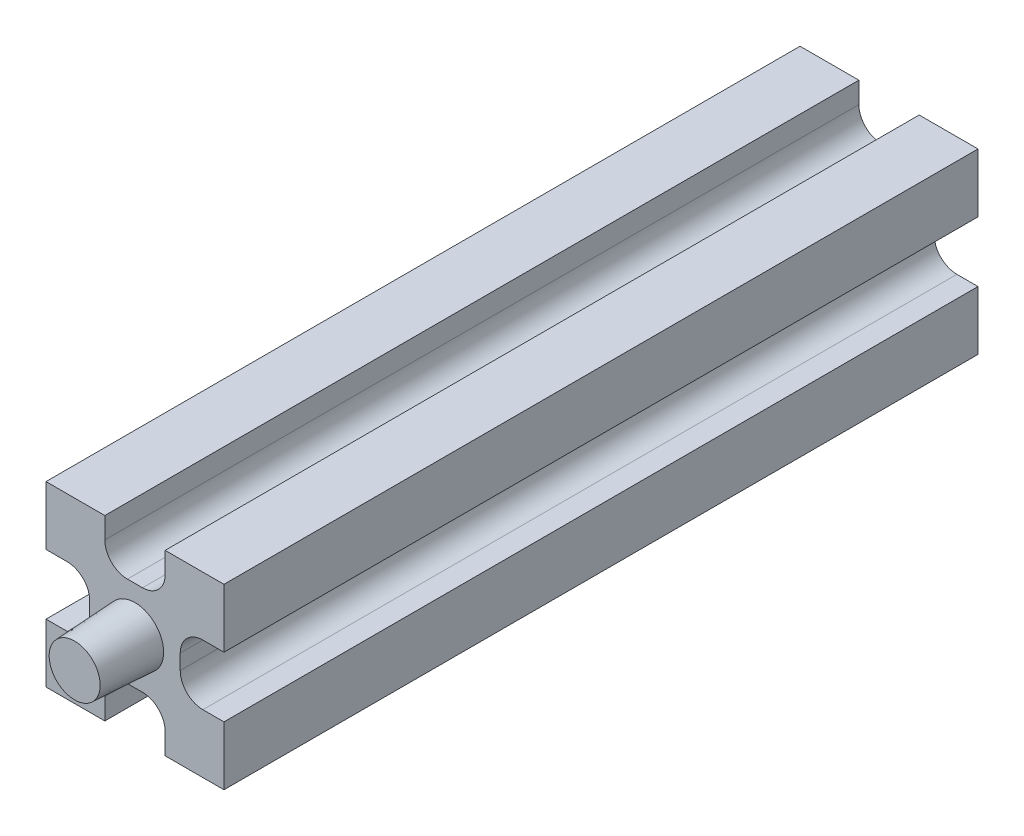
ISO-10303-21;
HEADER;
FILE_DESCRIPTION(('STEP AP214'),'2;1');
FILE_NAME('part.step','',(''),(''),'','','');
FILE_SCHEMA(('AUTOMOTIVE_DESIGN { 1 0 10303 214 1 1 1 1 }'));
ENDSEC;
DATA;
#1=APPLICATION_CONTEXT('core data for automotive mechanical design processes');
#2=APPLICATION_PROTOCOL_DEFINITION('international standard','automotive_design',2000,#1);
#3=PRODUCT_CONTEXT('',#1,'mechanical');
#4=PRODUCT('Part','Part','',(#3));
#5=PRODUCT_RELATED_PRODUCT_CATEGORY('part','',(#4));
#6=PRODUCT_DEFINITION_FORMATION('','',#4);
#7=PRODUCT_DEFINITION_CONTEXT('part definition',#1,'design');
#8=PRODUCT_DEFINITION('design','',#6,#7);
#9=PRODUCT_DEFINITION_SHAPE('','',#8);
#10=(LENGTH_UNIT() NAMED_UNIT(*) SI_UNIT(.MILLI.,.METRE.));
#11=(NAMED_UNIT(*) PLANE_ANGLE_UNIT() SI_UNIT($,.RADIAN.));
#12=(NAMED_UNIT(*) SI_UNIT($,.STERADIAN.) SOLID_ANGLE_UNIT());
#13=UNCERTAINTY_MEASURE_WITH_UNIT(LENGTH_MEASURE(1.E-05),#10,'distance_accuracy_value','');
#14=(GEOMETRIC_REPRESENTATION_CONTEXT(3) GLOBAL_UNCERTAINTY_ASSIGNED_CONTEXT((#13)) GLOBAL_UNIT_ASSIGNED_CONTEXT((#10,
#11,#12)) REPRESENTATION_CONTEXT('',''));
#15=CARTESIAN_POINT('',(0.,0.,0.));
#16=DIRECTION('',(0.,0.,1.));
#17=DIRECTION('',(1.,0.,0.));
#18=AXIS2_PLACEMENT_3D('',#15,#16,#17);
#19=CARTESIAN_POINT('',(121743.416897498,0.,-50000.));
#20=DIRECTION('',(-1.,0.,0.));
#21=DIRECTION('',(0.,0.,1.));
#22=AXIS2_PLACEMENT_3D('',#19,#20,#21);
#23=PLANE('',#22);
#24=DIRECTION('',(0.,-1.,0.));
#25=VECTOR('',#24,1.);
#26=CARTESIAN_POINT('',(121743.416897498,0.,0.));
#27=LINE('',#26,#25);
#28=CARTESIAN_POINT('',(121743.416897498,168837.836627923,0.));
#29=VERTEX_POINT('',#28);
#30=CARTESIAN_POINT('',(121743.416897498,167837.836627923,0.));
#31=VERTEX_POINT('',#30);
#32=EDGE_CURVE('E249',#29,#31,#27,.T.);
#33=ORIENTED_EDGE('',*,*,#32,.F.);
#34=DIRECTION('',(0.,0.,1.));
#35=VECTOR('',#34,1.);
#36=CARTESIAN_POINT('',(121743.416897498,168837.836627923,-50000.));
#37=LINE('',#36,#35);
#38=CARTESIAN_POINT('',(121743.416897498,168837.836627923,-50000.));
#39=VERTEX_POINT('',#38);
#40=EDGE_CURVE('E11',#39,#29,#37,.T.);
#41=ORIENTED_EDGE('',*,*,#40,.F.);
#42=DIRECTION('',(0.,-1.,0.));
#43=VECTOR('',#42,1.);
#44=CARTESIAN_POINT('',(121743.416897498,0.,-50000.));
#45=LINE('',#44,#43);
#46=CARTESIAN_POINT('',(121743.416897498,167837.836627923,-50000.));
#47=VERTEX_POINT('',#46);
#48=EDGE_CURVE('E317',#39,#47,#45,.T.);
#49=ORIENTED_EDGE('',*,*,#48,.T.);
#50=DIRECTION('',(0.,0.,1.));
#51=VECTOR('',#50,1.);
#52=CARTESIAN_POINT('',(121743.416897498,167837.836627923,-50000.));
#53=LINE('',#52,#51);
#54=EDGE_CURVE('E38',#47,#31,#53,.T.);
#55=ORIENTED_EDGE('',*,*,#54,.T.);
#56=EDGE_LOOP('',(#33,#41,#49,#55));
#57=FACE_BOUND('',#56,.T.);
#58=ADVANCED_FACE('F35',(#57),#23,.T.);
#59=CARTESIAN_POINT('',(120243.416897498,168837.836627923,-50000.));
#60=DIRECTION('',(0.,0.,1.));
#61=DIRECTION('',(1.,0.,0.));
#62=AXIS2_PLACEMENT_3D('',#59,#60,#61);
#63=CYLINDRICAL_SURFACE('',#62,1500.00000000001);
#64=CARTESIAN_POINT('',(120243.416897498,168837.836627923,0.));
#65=DIRECTION('',(0.,0.,1.));
#66=DIRECTION('',(1.,0.,0.));
#67=AXIS2_PLACEMENT_3D('',#64,#65,#66);
#68=CIRCLE('',#67,1500.00000000001);
#69=CARTESIAN_POINT('',(120243.416897498,170337.836627923,0.));
#70=VERTEX_POINT('',#69);
#71=EDGE_CURVE('E315',#70,#29,#68,.F.);
#72=ORIENTED_EDGE('',*,*,#71,.F.);
#73=DIRECTION('',(0.,0.,1.));
#74=VECTOR('',#73,1.);
#75=CARTESIAN_POINT('',(120243.416897498,170337.836627923,-50000.));
#76=LINE('',#75,#74);
#77=CARTESIAN_POINT('',(120243.416897498,170337.836627923,-50000.));
#78=VERTEX_POINT('',#77);
#79=EDGE_CURVE('E44',#78,#70,#76,.T.);
#80=ORIENTED_EDGE('',*,*,#79,.F.);
#81=CARTESIAN_POINT('',(120243.416897498,168837.836627923,-50000.));
#82=DIRECTION('',(0.,0.,1.));
#83=DIRECTION('',(1.,0.,0.));
#84=AXIS2_PLACEMENT_3D('',#81,#82,#83);
#85=CIRCLE('',#84,1500.00000000001);
#86=EDGE_CURVE('E244',#78,#39,#85,.F.);
#87=ORIENTED_EDGE('',*,*,#86,.T.);
#88=ORIENTED_EDGE('',*,*,#40,.T.);
#89=EDGE_LOOP('',(#72,#80,#87,#88));
#90=FACE_BOUND('',#89,.T.);
#91=ADVANCED_FACE('F382',(#90),#63,.F.);
#92=CARTESIAN_POINT('',(0.,170337.836627923,-50000.));
#93=DIRECTION('',(0.,-1.,0.));
#94=DIRECTION('',(0.,0.,-1.));
#95=AXIS2_PLACEMENT_3D('',#92,#93,#94);
#96=PLANE('',#95);
#97=DIRECTION('',(1.,0.,0.));
#98=VECTOR('',#97,1.);
#99=CARTESIAN_POINT('',(0.,170337.836627923,0.));
#100=LINE('',#99,#98);
#101=CARTESIAN_POINT('',(118843.416897498,170337.836627923,0.));
#102=VERTEX_POINT('',#101);
#103=EDGE_CURVE('E230',#102,#70,#100,.T.);
#104=ORIENTED_EDGE('',*,*,#103,.F.);
#105=DIRECTION('',(0.,0.,1.));
#106=VECTOR('',#105,1.);
#107=CARTESIAN_POINT('',(118843.416897498,170337.836627923,-50000.));
#108=LINE('',#107,#106);
#109=CARTESIAN_POINT('',(118843.416897498,170337.836627923,-50000.));
#110=VERTEX_POINT('',#109);
#111=EDGE_CURVE('E224',#110,#102,#108,.T.);
#112=ORIENTED_EDGE('',*,*,#111,.F.);
#113=DIRECTION('',(1.,0.,0.));
#114=VECTOR('',#113,1.);
#115=CARTESIAN_POINT('',(0.,170337.836627923,-50000.));
#116=LINE('',#115,#114);
#117=EDGE_CURVE('E228',#110,#78,#116,.T.);
#118=ORIENTED_EDGE('',*,*,#117,.T.);
#119=ORIENTED_EDGE('',*,*,#79,.T.);
#120=EDGE_LOOP('',(#104,#112,#118,#119));
#121=FACE_BOUND('',#120,.T.);
#122=ADVANCED_FACE('F226',(#121),#96,.T.);
#123=CARTESIAN_POINT('',(118843.416897498,0.,-50000.));
#124=DIRECTION('',(1.,0.,0.));
#125=DIRECTION('',(0.,0.,-1.));
#126=AXIS2_PLACEMENT_3D('',#123,#124,#125);
#127=PLANE('',#126);
#128=DIRECTION('',(0.,1.,0.));
#129=VECTOR('',#128,1.);
#130=CARTESIAN_POINT('',(118843.416897498,0.,0.));
#131=LINE('',#130,#129);
#132=CARTESIAN_POINT('',(118843.416897498,174237.836627923,0.));
#133=VERTEX_POINT('',#132);
#134=EDGE_CURVE('E312',#102,#133,#131,.T.);
#135=ORIENTED_EDGE('',*,*,#134,.T.);
#136=DIRECTION('',(0.,0.,1.));
#137=VECTOR('',#136,1.);
#138=CARTESIAN_POINT('',(118843.416897498,174237.836627923,-50000.));
#139=LINE('',#138,#137);
#140=CARTESIAN_POINT('',(118843.416897498,174237.836627923,-50000.));
#141=VERTEX_POINT('',#140);
#142=EDGE_CURVE('E233',#141,#133,#139,.T.);
#143=ORIENTED_EDGE('',*,*,#142,.F.);
#144=DIRECTION('',(0.,1.,0.));
#145=VECTOR('',#144,1.);
#146=CARTESIAN_POINT('',(118843.416897498,0.,-50000.));
#147=LINE('',#146,#145);
#148=EDGE_CURVE('E236',#110,#141,#147,.T.);
#149=ORIENTED_EDGE('',*,*,#148,.F.);
#150=ORIENTED_EDGE('',*,*,#111,.T.);
#151=EDGE_LOOP('',(#135,#143,#149,#150));
#152=FACE_BOUND('',#151,.T.);
#153=ADVANCED_FACE('F237',(#152),#127,.F.);
#154=CARTESIAN_POINT('',(0.,174237.836627923,-50000.));
#155=DIRECTION('',(0.,-1.,0.));
#156=DIRECTION('',(0.,0.,-1.));
#157=AXIS2_PLACEMENT_3D('',#154,#155,#156);
#158=PLANE('',#157);
#159=DIRECTION('',(1.,0.,0.));
#160=VECTOR('',#159,1.);
#161=CARTESIAN_POINT('',(0.,174237.836627923,0.));
#162=LINE('',#161,#160);
#163=CARTESIAN_POINT('',(122743.416897498,174237.836627923,0.));
#164=VERTEX_POINT('',#163);
#165=EDGE_CURVE('E310',#133,#164,#162,.T.);
#166=ORIENTED_EDGE('',*,*,#165,.T.);
#167=DIRECTION('',(0.,0.,1.));
#168=VECTOR('',#167,1.);
#169=CARTESIAN_POINT('',(122743.416897498,174237.836627923,-50000.));
#170=LINE('',#169,#168);
#171=CARTESIAN_POINT('',(122743.416897498,174237.836627923,-50000.));
#172=VERTEX_POINT('',#171);
#173=EDGE_CURVE('E321',#172,#164,#170,.T.);
#174=ORIENTED_EDGE('',*,*,#173,.F.);
#175=DIRECTION('',(1.,0.,0.));
#176=VECTOR('',#175,1.);
#177=CARTESIAN_POINT('',(0.,174237.836627923,-50000.));
#178=LINE('',#177,#176);
#179=EDGE_CURVE('E241',#141,#172,#178,.T.);
#180=ORIENTED_EDGE('',*,*,#179,.F.);
#181=ORIENTED_EDGE('',*,*,#142,.T.);
#182=EDGE_LOOP('',(#166,#174,#180,#181));
#183=FACE_BOUND('',#182,.T.);
#184=ADVANCED_FACE('F395',(#183),#158,.F.);
#185=CARTESIAN_POINT('',(122743.416897498,0.,-50000.));
#186=DIRECTION('',(-1.,0.,0.));
#187=DIRECTION('',(0.,0.,1.));
#188=AXIS2_PLACEMENT_3D('',#185,#186,#187);
#189=PLANE('',#188);
#190=DIRECTION('',(0.,-1.,0.));
#191=VECTOR('',#190,1.);
#192=CARTESIAN_POINT('',(122743.416897498,0.,0.));
#193=LINE('',#192,#191);
#194=CARTESIAN_POINT('',(122743.416897498,172837.836627923,0.));
#195=VERTEX_POINT('',#194);
#196=EDGE_CURVE('E308',#164,#195,#193,.T.);
#197=ORIENTED_EDGE('',*,*,#196,.T.);
#198=DIRECTION('',(0.,0.,1.));
#199=VECTOR('',#198,1.);
#200=CARTESIAN_POINT('',(122743.416897498,172837.836627923,-50000.));
#201=LINE('',#200,#199);
#202=CARTESIAN_POINT('',(122743.416897498,172837.836627923,-50000.));
#203=VERTEX_POINT('',#202);
#204=EDGE_CURVE('E324',#203,#195,#201,.T.);
#205=ORIENTED_EDGE('',*,*,#204,.F.);
#206=DIRECTION('',(0.,-1.,0.));
#207=VECTOR('',#206,1.);
#208=CARTESIAN_POINT('',(122743.416897498,0.,-50000.));
#209=LINE('',#208,#207);
#210=EDGE_CURVE('E564',#172,#203,#209,.T.);
#211=ORIENTED_EDGE('',*,*,#210,.F.);
#212=ORIENTED_EDGE('',*,*,#173,.T.);
#213=EDGE_LOOP('',(#197,#205,#211,#212));
#214=FACE_BOUND('',#213,.T.);
#215=ADVANCED_FACE('F398',(#214),#189,.F.);
#216=CARTESIAN_POINT('',(124243.416897498,172837.836627923,-50000.));
#217=DIRECTION('',(0.,0.,1.));
#218=DIRECTION('',(1.,0.,0.));
#219=AXIS2_PLACEMENT_3D('',#216,#217,#218);
#220=CYLINDRICAL_SURFACE('',#219,1500.);
#221=CARTESIAN_POINT('',(124243.416897498,172837.836627923,0.));
#222=DIRECTION('',(0.,0.,1.));
#223=DIRECTION('',(1.,0.,0.));
#224=AXIS2_PLACEMENT_3D('',#221,#222,#223);
#225=CIRCLE('',#224,1500.);
#226=CARTESIAN_POINT('',(124243.416897498,171337.836627923,0.));
#227=VERTEX_POINT('',#226);
#228=EDGE_CURVE('E306',#195,#227,#225,.T.);
#229=ORIENTED_EDGE('',*,*,#228,.T.);
#230=DIRECTION('',(0.,0.,1.));
#231=VECTOR('',#230,1.);
#232=CARTESIAN_POINT('',(124243.416897498,171337.836627923,-50000.));
#233=LINE('',#232,#231);
#234=CARTESIAN_POINT('',(124243.416897498,171337.836627923,-50000.));
#235=VERTEX_POINT('',#234);
#236=EDGE_CURVE('E327',#235,#227,#233,.T.);
#237=ORIENTED_EDGE('',*,*,#236,.F.);
#238=CARTESIAN_POINT('',(124243.416897498,172837.836627923,-50000.));
#239=DIRECTION('',(0.,0.,1.));
#240=DIRECTION('',(1.,0.,0.));
#241=AXIS2_PLACEMENT_3D('',#238,#239,#240);
#242=CIRCLE('',#241,1500.);
#243=EDGE_CURVE('E562',#203,#235,#242,.T.);
#244=ORIENTED_EDGE('',*,*,#243,.F.);
#245=ORIENTED_EDGE('',*,*,#204,.T.);
#246=EDGE_LOOP('',(#229,#237,#244,#245));
#247=FACE_BOUND('',#246,.T.);
#248=ADVANCED_FACE('F402',(#247),#220,.F.);
#249=CARTESIAN_POINT('',(0.,171337.836627923,-50000.));
#250=DIRECTION('',(0.,-1.,0.));
#251=DIRECTION('',(0.,0.,-1.));
#252=AXIS2_PLACEMENT_3D('',#249,#250,#251);
#253=PLANE('',#252);
#254=DIRECTION('',(1.,0.,0.));
#255=VECTOR('',#254,1.);
#256=CARTESIAN_POINT('',(0.,171337.836627923,0.));
#257=LINE('',#256,#255);
#258=CARTESIAN_POINT('',(125243.416897498,171337.836627923,0.));
#259=VERTEX_POINT('',#258);
#260=EDGE_CURVE('E304',#227,#259,#257,.T.);
#261=ORIENTED_EDGE('',*,*,#260,.T.);
#262=DIRECTION('',(0.,0.,1.));
#263=VECTOR('',#262,1.);
#264=CARTESIAN_POINT('',(125243.416897498,171337.836627923,-50000.));
#265=LINE('',#264,#263);
#266=CARTESIAN_POINT('',(125243.416897498,171337.836627923,-50000.));
#267=VERTEX_POINT('',#266);
#268=EDGE_CURVE('E330',#267,#259,#265,.T.);
#269=ORIENTED_EDGE('',*,*,#268,.F.);
#270=DIRECTION('',(1.,0.,0.));
#271=VECTOR('',#270,1.);
#272=CARTESIAN_POINT('',(0.,171337.836627923,-50000.));
#273=LINE('',#272,#271);
#274=EDGE_CURVE('E560',#235,#267,#273,.T.);
#275=ORIENTED_EDGE('',*,*,#274,.F.);
#276=ORIENTED_EDGE('',*,*,#236,.T.);
#277=EDGE_LOOP('',(#261,#269,#275,#276));
#278=FACE_BOUND('',#277,.T.);
#279=ADVANCED_FACE('F406',(#278),#253,.F.);
#280=CARTESIAN_POINT('',(125243.416897498,172837.836627923,-50000.));
#281=DIRECTION('',(0.,0.,1.));
#282=DIRECTION('',(1.,0.,0.));
#283=AXIS2_PLACEMENT_3D('',#280,#281,#282);
#284=CYLINDRICAL_SURFACE('',#283,1500.);
#285=CARTESIAN_POINT('',(125243.416897498,172837.836627923,0.));
#286=DIRECTION('',(0.,0.,1.));
#287=DIRECTION('',(1.,0.,0.));
#288=AXIS2_PLACEMENT_3D('',#285,#286,#287);
#289=CIRCLE('',#288,1500.);
#290=CARTESIAN_POINT('',(126743.416897498,172837.836627923,0.));
#291=VERTEX_POINT('',#290);
#292=EDGE_CURVE('E302',#259,#291,#289,.T.);
#293=ORIENTED_EDGE('',*,*,#292,.T.);
#294=DIRECTION('',(0.,0.,1.));
#295=VECTOR('',#294,1.);
#296=CARTESIAN_POINT('',(126743.416897498,172837.836627923,-50000.));
#297=LINE('',#296,#295);
#298=CARTESIAN_POINT('',(126743.416897498,172837.836627923,-50000.));
#299=VERTEX_POINT('',#298);
#300=EDGE_CURVE('E333',#299,#291,#297,.T.);
#301=ORIENTED_EDGE('',*,*,#300,.F.);
#302=CARTESIAN_POINT('',(125243.416897498,172837.836627923,-50000.));
#303=DIRECTION('',(0.,0.,1.));
#304=DIRECTION('',(1.,0.,0.));
#305=AXIS2_PLACEMENT_3D('',#302,#303,#304);
#306=CIRCLE('',#305,1500.);
#307=EDGE_CURVE('E558',#267,#299,#306,.T.);
#308=ORIENTED_EDGE('',*,*,#307,.F.);
#309=ORIENTED_EDGE('',*,*,#268,.T.);
#310=EDGE_LOOP('',(#293,#301,#308,#309));
#311=FACE_BOUND('',#310,.T.);
#312=ADVANCED_FACE('F410',(#311),#284,.F.);
#313=CARTESIAN_POINT('',(126743.416897496,-1.2865230597419E-09,-50000.));
#314=DIRECTION('',(1.,0.,0.));
#315=DIRECTION('',(0.,1.,0.));
#316=AXIS2_PLACEMENT_3D('',#313,#314,#315);
#317=PLANE('',#316);
#318=DIRECTION('',(0.,1.,0.));
#319=VECTOR('',#318,1.);
#320=CARTESIAN_POINT('',(126743.416897496,-1.2865230597419E-09,0.));
#321=LINE('',#320,#319);
#322=CARTESIAN_POINT('',(126743.416897498,174237.836627923,0.));
#323=VERTEX_POINT('',#322);
#324=EDGE_CURVE('E300',#291,#323,#321,.T.);
#325=ORIENTED_EDGE('',*,*,#324,.T.);
#326=DIRECTION('',(0.,0.,1.));
#327=VECTOR('',#326,1.);
#328=CARTESIAN_POINT('',(126743.416897498,174237.836627923,-50000.));
#329=LINE('',#328,#327);
#330=CARTESIAN_POINT('',(126743.416897498,174237.836627923,-50000.));
#331=VERTEX_POINT('',#330);
#332=EDGE_CURVE('E336',#331,#323,#329,.T.);
#333=ORIENTED_EDGE('',*,*,#332,.F.);
#334=DIRECTION('',(0.,1.,0.));
#335=VECTOR('',#334,1.);
#336=CARTESIAN_POINT('',(126743.416897496,-1.2865230597419E-09,-50000.));
#337=LINE('',#336,#335);
#338=EDGE_CURVE('E556',#299,#331,#337,.T.);
#339=ORIENTED_EDGE('',*,*,#338,.F.);
#340=ORIENTED_EDGE('',*,*,#300,.T.);
#341=EDGE_LOOP('',(#325,#333,#339,#340));
#342=FACE_BOUND('',#341,.T.);
#343=ADVANCED_FACE('F414',(#342),#317,.F.);
#344=CARTESIAN_POINT('',(0.,174237.836627923,-50000.));
#345=DIRECTION('',(0.,-1.,0.));
#346=DIRECTION('',(0.,0.,-1.));
#347=AXIS2_PLACEMENT_3D('',#344,#345,#346);
#348=PLANE('',#347);
#349=DIRECTION('',(1.,0.,0.));
#350=VECTOR('',#349,1.);
#351=CARTESIAN_POINT('',(0.,174237.836627923,0.));
#352=LINE('',#351,#350);
#353=CARTESIAN_POINT('',(130643.416897498,174237.836627923,0.));
#354=VERTEX_POINT('',#353);
#355=EDGE_CURVE('E298',#323,#354,#352,.T.);
#356=ORIENTED_EDGE('',*,*,#355,.T.);
#357=DIRECTION('',(0.,0.,1.));
#358=VECTOR('',#357,1.);
#359=CARTESIAN_POINT('',(130643.416897498,174237.836627923,-50000.));
#360=LINE('',#359,#358);
#361=CARTESIAN_POINT('',(130643.416897498,174237.836627923,-50000.));
#362=VERTEX_POINT('',#361);
#363=EDGE_CURVE('E339',#362,#354,#360,.T.);
#364=ORIENTED_EDGE('',*,*,#363,.F.);
#365=DIRECTION('',(1.,0.,0.));
#366=VECTOR('',#365,1.);
#367=CARTESIAN_POINT('',(0.,174237.836627923,-50000.));
#368=LINE('',#367,#366);
#369=EDGE_CURVE('E554',#331,#362,#368,.T.);
#370=ORIENTED_EDGE('',*,*,#369,.F.);
#371=ORIENTED_EDGE('',*,*,#332,.T.);
#372=EDGE_LOOP('',(#356,#364,#370,#371));
#373=FACE_BOUND('',#372,.T.);
#374=ADVANCED_FACE('F418',(#373),#348,.F.);
#375=CARTESIAN_POINT('',(130643.416897498,0.,-50000.));
#376=DIRECTION('',(-1.,0.,0.));
#377=DIRECTION('',(0.,0.,1.));
#378=AXIS2_PLACEMENT_3D('',#375,#376,#377);
#379=PLANE('',#378);
#380=DIRECTION('',(0.,-1.,0.));
#381=VECTOR('',#380,1.);
#382=CARTESIAN_POINT('',(130643.416897498,0.,0.));
#383=LINE('',#382,#381);
#384=CARTESIAN_POINT('',(130643.416897498,170337.836627923,0.));
#385=VERTEX_POINT('',#384);
#386=EDGE_CURVE('E296',#354,#385,#383,.T.);
#387=ORIENTED_EDGE('',*,*,#386,.T.);
#388=DIRECTION('',(0.,0.,1.));
#389=VECTOR('',#388,1.);
#390=CARTESIAN_POINT('',(130643.416897498,170337.836627923,-50000.));
#391=LINE('',#390,#389);
#392=CARTESIAN_POINT('',(130643.416897498,170337.836627923,-50000.));
#393=VERTEX_POINT('',#392);
#394=EDGE_CURVE('E342',#393,#385,#391,.T.);
#395=ORIENTED_EDGE('',*,*,#394,.F.);
#396=DIRECTION('',(0.,-1.,0.));
#397=VECTOR('',#396,1.);
#398=CARTESIAN_POINT('',(130643.416897498,0.,-50000.));
#399=LINE('',#398,#397);
#400=EDGE_CURVE('E552',#362,#393,#399,.T.);
#401=ORIENTED_EDGE('',*,*,#400,.F.);
#402=ORIENTED_EDGE('',*,*,#363,.T.);
#403=EDGE_LOOP('',(#387,#395,#401,#402));
#404=FACE_BOUND('',#403,.T.);
#405=ADVANCED_FACE('F422',(#404),#379,.F.);
#406=CARTESIAN_POINT('',(0.,170337.836627923,-50000.));
#407=DIRECTION('',(0.,1.,0.));
#408=DIRECTION('',(0.,0.,1.));
#409=AXIS2_PLACEMENT_3D('',#406,#407,#408);
#410=PLANE('',#409);
#411=DIRECTION('',(-1.,0.,0.));
#412=VECTOR('',#411,1.);
#413=CARTESIAN_POINT('',(0.,170337.836627923,0.));
#414=LINE('',#413,#412);
#415=CARTESIAN_POINT('',(129243.416897498,170337.836627923,0.));
#416=VERTEX_POINT('',#415);
#417=EDGE_CURVE('E294',#385,#416,#414,.T.);
#418=ORIENTED_EDGE('',*,*,#417,.T.);
#419=DIRECTION('',(0.,0.,1.));
#420=VECTOR('',#419,1.);
#421=CARTESIAN_POINT('',(129243.416897498,170337.836627923,-50000.));
#422=LINE('',#421,#420);
#423=CARTESIAN_POINT('',(129243.416897498,170337.836627923,-50000.));
#424=VERTEX_POINT('',#423);
#425=EDGE_CURVE('E345',#424,#416,#422,.T.);
#426=ORIENTED_EDGE('',*,*,#425,.F.);
#427=DIRECTION('',(-1.,0.,0.));
#428=VECTOR('',#427,1.);
#429=CARTESIAN_POINT('',(0.,170337.836627923,-50000.));
#430=LINE('',#429,#428);
#431=EDGE_CURVE('E550',#393,#424,#430,.T.);
#432=ORIENTED_EDGE('',*,*,#431,.F.);
#433=ORIENTED_EDGE('',*,*,#394,.T.);
#434=EDGE_LOOP('',(#418,#426,#432,#433));
#435=FACE_BOUND('',#434,.T.);
#436=ADVANCED_FACE('F426',(#435),#410,.F.);
#437=CARTESIAN_POINT('',(129243.416897498,168837.836627923,-50000.));
#438=DIRECTION('',(0.,0.,1.));
#439=DIRECTION('',(1.,0.,0.));
#440=AXIS2_PLACEMENT_3D('',#437,#438,#439);
#441=CYLINDRICAL_SURFACE('',#440,1500.00000000001);
#442=CARTESIAN_POINT('',(129243.416897498,168837.836627923,0.));
#443=DIRECTION('',(0.,0.,1.));
#444=DIRECTION('',(1.,0.,0.));
#445=AXIS2_PLACEMENT_3D('',#442,#443,#444);
#446=CIRCLE('',#445,1500.00000000001);
#447=CARTESIAN_POINT('',(127743.416897498,168837.836627923,0.));
#448=VERTEX_POINT('',#447);
#449=EDGE_CURVE('E292',#416,#448,#446,.T.);
#450=ORIENTED_EDGE('',*,*,#449,.T.);
#451=DIRECTION('',(0.,0.,1.));
#452=VECTOR('',#451,1.);
#453=CARTESIAN_POINT('',(127743.416897498,168837.836627923,-50000.));
#454=LINE('',#453,#452);
#455=CARTESIAN_POINT('',(127743.416897498,168837.836627923,-50000.));
#456=VERTEX_POINT('',#455);
#457=EDGE_CURVE('E348',#456,#448,#454,.T.);
#458=ORIENTED_EDGE('',*,*,#457,.F.);
#459=CARTESIAN_POINT('',(129243.416897498,168837.836627923,-50000.));
#460=DIRECTION('',(0.,0.,1.));
#461=DIRECTION('',(1.,0.,0.));
#462=AXIS2_PLACEMENT_3D('',#459,#460,#461);
#463=CIRCLE('',#462,1500.00000000001);
#464=EDGE_CURVE('E548',#424,#456,#463,.T.);
#465=ORIENTED_EDGE('',*,*,#464,.F.);
#466=ORIENTED_EDGE('',*,*,#425,.T.);
#467=EDGE_LOOP('',(#450,#458,#465,#466));
#468=FACE_BOUND('',#467,.T.);
#469=ADVANCED_FACE('F430',(#468),#441,.F.);
#470=CARTESIAN_POINT('',(127743.416897498,0.,-50000.));
#471=DIRECTION('',(-1.,0.,0.));
#472=DIRECTION('',(0.,0.,1.));
#473=AXIS2_PLACEMENT_3D('',#470,#471,#472);
#474=PLANE('',#473);
#475=DIRECTION('',(0.,-1.,0.));
#476=VECTOR('',#475,1.);
#477=CARTESIAN_POINT('',(127743.416897498,0.,0.));
#478=LINE('',#477,#476);
#479=CARTESIAN_POINT('',(127743.416897498,167837.836627923,0.));
#480=VERTEX_POINT('',#479);
#481=EDGE_CURVE('E290',#448,#480,#478,.T.);
#482=ORIENTED_EDGE('',*,*,#481,.T.);
#483=DIRECTION('',(0.,0.,1.));
#484=VECTOR('',#483,1.);
#485=CARTESIAN_POINT('',(127743.416897498,167837.836627923,-50000.));
#486=LINE('',#485,#484);
#487=CARTESIAN_POINT('',(127743.416897498,167837.836627923,-50000.));
#488=VERTEX_POINT('',#487);
#489=EDGE_CURVE('E351',#488,#480,#486,.T.);
#490=ORIENTED_EDGE('',*,*,#489,.F.);
#491=DIRECTION('',(0.,-1.,0.));
#492=VECTOR('',#491,1.);
#493=CARTESIAN_POINT('',(127743.416897498,0.,-50000.));
#494=LINE('',#493,#492);
#495=EDGE_CURVE('E546',#456,#488,#494,.T.);
#496=ORIENTED_EDGE('',*,*,#495,.F.);
#497=ORIENTED_EDGE('',*,*,#457,.T.);
#498=EDGE_LOOP('',(#482,#490,#496,#497));
#499=FACE_BOUND('',#498,.T.);
#500=ADVANCED_FACE('F434',(#499),#474,.F.);
#501=CARTESIAN_POINT('',(129243.416897498,167837.836627923,-50000.));
#502=DIRECTION('',(0.,0.,1.));
#503=DIRECTION('',(1.,0.,0.));
#504=AXIS2_PLACEMENT_3D('',#501,#502,#503);
#505=CYLINDRICAL_SURFACE('',#504,1500.00000000001);
#506=CARTESIAN_POINT('',(129243.416897498,167837.836627923,0.));
#507=DIRECTION('',(0.,0.,1.));
#508=DIRECTION('',(1.,0.,0.));
#509=AXIS2_PLACEMENT_3D('',#506,#507,#508);
#510=CIRCLE('',#509,1500.00000000001);
#511=CARTESIAN_POINT('',(129243.416897498,166337.836627923,0.));
#512=VERTEX_POINT('',#511);
#513=EDGE_CURVE('E288',#480,#512,#510,.T.);
#514=ORIENTED_EDGE('',*,*,#513,.T.);
#515=DIRECTION('',(0.,0.,1.));
#516=VECTOR('',#515,1.);
#517=CARTESIAN_POINT('',(129243.416897498,166337.836627923,-50000.));
#518=LINE('',#517,#516);
#519=CARTESIAN_POINT('',(129243.416897498,166337.836627923,-50000.));
#520=VERTEX_POINT('',#519);
#521=EDGE_CURVE('E354',#520,#512,#518,.T.);
#522=ORIENTED_EDGE('',*,*,#521,.F.);
#523=CARTESIAN_POINT('',(129243.416897498,167837.836627923,-50000.));
#524=DIRECTION('',(0.,0.,1.));
#525=DIRECTION('',(1.,0.,0.));
#526=AXIS2_PLACEMENT_3D('',#523,#524,#525);
#527=CIRCLE('',#526,1500.00000000001);
#528=EDGE_CURVE('E544',#488,#520,#527,.T.);
#529=ORIENTED_EDGE('',*,*,#528,.F.);
#530=ORIENTED_EDGE('',*,*,#489,.T.);
#531=EDGE_LOOP('',(#514,#522,#529,#530));
#532=FACE_BOUND('',#531,.T.);
#533=ADVANCED_FACE('F438',(#532),#505,.F.);
#534=CARTESIAN_POINT('',(0.,166337.836627923,-50000.));
#535=DIRECTION('',(0.,-1.,0.));
#536=DIRECTION('',(0.,0.,-1.));
#537=AXIS2_PLACEMENT_3D('',#534,#535,#536);
#538=PLANE('',#537);
#539=DIRECTION('',(1.,0.,0.));
#540=VECTOR('',#539,1.);
#541=CARTESIAN_POINT('',(0.,166337.836627923,0.));
#542=LINE('',#541,#540);
#543=CARTESIAN_POINT('',(130643.416897498,166337.836627923,0.));
#544=VERTEX_POINT('',#543);
#545=EDGE_CURVE('E286',#512,#544,#542,.T.);
#546=ORIENTED_EDGE('',*,*,#545,.T.);
#547=DIRECTION('',(0.,0.,1.));
#548=VECTOR('',#547,1.);
#549=CARTESIAN_POINT('',(130643.416897498,166337.836627923,-50000.));
#550=LINE('',#549,#548);
#551=CARTESIAN_POINT('',(130643.416897498,166337.836627923,-50000.));
#552=VERTEX_POINT('',#551);
#553=EDGE_CURVE('E357',#552,#544,#550,.T.);
#554=ORIENTED_EDGE('',*,*,#553,.F.);
#555=DIRECTION('',(1.,0.,0.));
#556=VECTOR('',#555,1.);
#557=CARTESIAN_POINT('',(0.,166337.836627923,-50000.));
#558=LINE('',#557,#556);
#559=EDGE_CURVE('E542',#520,#552,#558,.T.);
#560=ORIENTED_EDGE('',*,*,#559,.F.);
#561=ORIENTED_EDGE('',*,*,#521,.T.);
#562=EDGE_LOOP('',(#546,#554,#560,#561));
#563=FACE_BOUND('',#562,.T.);
#564=ADVANCED_FACE('F442',(#563),#538,.F.);
#565=CARTESIAN_POINT('',(130643.416897498,0.,-50000.));
#566=DIRECTION('',(-1.,0.,0.));
#567=DIRECTION('',(0.,0.,1.));
#568=AXIS2_PLACEMENT_3D('',#565,#566,#567);
#569=PLANE('',#568);
#570=DIRECTION('',(0.,-1.,0.));
#571=VECTOR('',#570,1.);
#572=CARTESIAN_POINT('',(130643.416897498,0.,0.));
#573=LINE('',#572,#571);
#574=CARTESIAN_POINT('',(130643.416897498,162437.836627923,0.));
#575=VERTEX_POINT('',#574);
#576=EDGE_CURVE('E283',#544,#575,#573,.T.);
#577=ORIENTED_EDGE('',*,*,#576,.T.);
#578=DIRECTION('',(0.,0.,1.));
#579=VECTOR('',#578,1.);
#580=CARTESIAN_POINT('',(130643.416897498,162437.836627923,-50000.));
#581=LINE('',#580,#579);
#582=CARTESIAN_POINT('',(130643.416897498,162437.836627923,-50000.));
#583=VERTEX_POINT('',#582);
#584=EDGE_CURVE('E360',#583,#575,#581,.T.);
#585=ORIENTED_EDGE('',*,*,#584,.F.);
#586=DIRECTION('',(0.,-1.,0.));
#587=VECTOR('',#586,1.);
#588=CARTESIAN_POINT('',(130643.416897498,0.,-50000.));
#589=LINE('',#588,#587);
#590=EDGE_CURVE('E540',#552,#583,#589,.T.);
#591=ORIENTED_EDGE('',*,*,#590,.F.);
#592=ORIENTED_EDGE('',*,*,#553,.T.);
#593=EDGE_LOOP('',(#577,#585,#591,#592));
#594=FACE_BOUND('',#593,.T.);
#595=ADVANCED_FACE('F446',(#594),#569,.F.);
#596=CARTESIAN_POINT('',(0.,162437.836627923,-50000.));
#597=DIRECTION('',(0.,-1.,0.));
#598=DIRECTION('',(0.,0.,-1.));
#599=AXIS2_PLACEMENT_3D('',#596,#597,#598);
#600=PLANE('',#599);
#601=DIRECTION('',(1.,0.,0.));
#602=VECTOR('',#601,1.);
#603=CARTESIAN_POINT('',(0.,162437.836627923,0.));
#604=LINE('',#603,#602);
#605=CARTESIAN_POINT('',(126743.416897498,162437.836627923,0.));
#606=VERTEX_POINT('',#605);
#607=EDGE_CURVE('E280',#606,#575,#604,.T.);
#608=ORIENTED_EDGE('',*,*,#607,.F.);
#609=DIRECTION('',(0.,0.,1.));
#610=VECTOR('',#609,1.);
#611=CARTESIAN_POINT('',(126743.416897498,162437.836627923,-50000.));
#612=LINE('',#611,#610);
#613=CARTESIAN_POINT('',(126743.416897498,162437.836627923,-50000.));
#614=VERTEX_POINT('',#613);
#615=EDGE_CURVE('E362',#614,#606,#612,.T.);
#616=ORIENTED_EDGE('',*,*,#615,.F.);
#617=DIRECTION('',(1.,0.,0.));
#618=VECTOR('',#617,1.);
#619=CARTESIAN_POINT('',(0.,162437.836627923,-50000.));
#620=LINE('',#619,#618);
#621=EDGE_CURVE('E537',#614,#583,#620,.T.);
#622=ORIENTED_EDGE('',*,*,#621,.T.);
#623=ORIENTED_EDGE('',*,*,#584,.T.);
#624=EDGE_LOOP('',(#608,#616,#622,#623));
#625=FACE_BOUND('',#624,.T.);
#626=ADVANCED_FACE('F450',(#625),#600,.T.);
#627=CARTESIAN_POINT('',(126743.416897498,0.,-50000.));
#628=DIRECTION('',(-1.,0.,0.));
#629=DIRECTION('',(0.,0.,1.));
#630=AXIS2_PLACEMENT_3D('',#627,#628,#629);
#631=PLANE('',#630);
#632=DIRECTION('',(0.,-1.,0.));
#633=VECTOR('',#632,1.);
#634=CARTESIAN_POINT('',(126743.416897498,0.,0.));
#635=LINE('',#634,#633);
#636=CARTESIAN_POINT('',(126743.416897498,163837.836627923,0.));
#637=VERTEX_POINT('',#636);
#638=EDGE_CURVE('E277',#637,#606,#635,.T.);
#639=ORIENTED_EDGE('',*,*,#638,.F.);
#640=DIRECTION('',(0.,0.,1.));
#641=VECTOR('',#640,1.);
#642=CARTESIAN_POINT('',(126743.416897498,163837.836627923,-50000.));
#643=LINE('',#642,#641);
#644=CARTESIAN_POINT('',(126743.416897498,163837.836627923,-50000.));
#645=VERTEX_POINT('',#644);
#646=EDGE_CURVE('E364',#645,#637,#643,.T.);
#647=ORIENTED_EDGE('',*,*,#646,.F.);
#648=DIRECTION('',(0.,-1.,0.));
#649=VECTOR('',#648,1.);
#650=CARTESIAN_POINT('',(126743.416897498,0.,-50000.));
#651=LINE('',#650,#649);
#652=EDGE_CURVE('E534',#645,#614,#651,.T.);
#653=ORIENTED_EDGE('',*,*,#652,.T.);
#654=ORIENTED_EDGE('',*,*,#615,.T.);
#655=EDGE_LOOP('',(#639,#647,#653,#654));
#656=FACE_BOUND('',#655,.T.);
#657=ADVANCED_FACE('F454',(#656),#631,.T.);
#658=CARTESIAN_POINT('',(125243.416897498,163837.836627923,-50000.));
#659=DIRECTION('',(0.,0.,1.));
#660=DIRECTION('',(1.,0.,0.));
#661=AXIS2_PLACEMENT_3D('',#658,#659,#660);
#662=CYLINDRICAL_SURFACE('',#661,1499.99999999999);
#663=CARTESIAN_POINT('',(125243.416897498,163837.836627923,0.));
#664=DIRECTION('',(0.,0.,1.));
#665=DIRECTION('',(1.,0.,0.));
#666=AXIS2_PLACEMENT_3D('',#663,#664,#665);
#667=CIRCLE('',#666,1499.99999999999);
#668=CARTESIAN_POINT('',(125243.416897498,165337.836627923,0.));
#669=VERTEX_POINT('',#668);
#670=EDGE_CURVE('E274',#669,#637,#667,.F.);
#671=ORIENTED_EDGE('',*,*,#670,.F.);
#672=DIRECTION('',(0.,0.,1.));
#673=VECTOR('',#672,1.);
#674=CARTESIAN_POINT('',(125243.416897498,165337.836627923,-50000.));
#675=LINE('',#674,#673);
#676=CARTESIAN_POINT('',(125243.416897498,165337.836627923,-50000.));
#677=VERTEX_POINT('',#676);
#678=EDGE_CURVE('E366',#677,#669,#675,.T.);
#679=ORIENTED_EDGE('',*,*,#678,.F.);
#680=CARTESIAN_POINT('',(125243.416897498,163837.836627923,-50000.));
#681=DIRECTION('',(0.,0.,1.));
#682=DIRECTION('',(1.,0.,0.));
#683=AXIS2_PLACEMENT_3D('',#680,#681,#682);
#684=CIRCLE('',#683,1499.99999999999);
#685=EDGE_CURVE('E531',#677,#645,#684,.F.);
#686=ORIENTED_EDGE('',*,*,#685,.T.);
#687=ORIENTED_EDGE('',*,*,#646,.T.);
#688=EDGE_LOOP('',(#671,#679,#686,#687));
#689=FACE_BOUND('',#688,.T.);
#690=ADVANCED_FACE('F458',(#689),#662,.F.);
#691=CARTESIAN_POINT('',(9.3983679009813E-09,165337.83662793,-50000.));
#692=DIRECTION('',(0.,-1.,0.));
#693=DIRECTION('',(1.,0.,0.));
#694=AXIS2_PLACEMENT_3D('',#691,#692,#693);
#695=PLANE('',#694);
#696=DIRECTION('',(1.,0.,0.));
#697=VECTOR('',#696,1.);
#698=CARTESIAN_POINT('',(9.3983679009813E-09,165337.83662793,0.));
#699=LINE('',#698,#697);
#700=CARTESIAN_POINT('',(124243.416897498,165337.836627923,0.));
#701=VERTEX_POINT('',#700);
#702=EDGE_CURVE('E271',#701,#669,#699,.T.);
#703=ORIENTED_EDGE('',*,*,#702,.F.);
#704=DIRECTION('',(0.,0.,1.));
#705=VECTOR('',#704,1.);
#706=CARTESIAN_POINT('',(124243.416897498,165337.836627923,-50000.));
#707=LINE('',#706,#705);
#708=CARTESIAN_POINT('',(124243.416897498,165337.836627923,-50000.));
#709=VERTEX_POINT('',#708);
#710=EDGE_CURVE('E368',#709,#701,#707,.T.);
#711=ORIENTED_EDGE('',*,*,#710,.F.);
#712=DIRECTION('',(1.,0.,0.));
#713=VECTOR('',#712,1.);
#714=CARTESIAN_POINT('',(9.3983679009813E-09,165337.83662793,-50000.));
#715=LINE('',#714,#713);
#716=EDGE_CURVE('E528',#709,#677,#715,.T.);
#717=ORIENTED_EDGE('',*,*,#716,.T.);
#718=ORIENTED_EDGE('',*,*,#678,.T.);
#719=EDGE_LOOP('',(#703,#711,#717,#718));
#720=FACE_BOUND('',#719,.T.);
#721=ADVANCED_FACE('F462',(#720),#695,.T.);
#722=CARTESIAN_POINT('',(124243.416897498,163837.836627923,-50000.));
#723=DIRECTION('',(0.,0.,1.));
#724=DIRECTION('',(1.,0.,0.));
#725=AXIS2_PLACEMENT_3D('',#722,#723,#724);
#726=CYLINDRICAL_SURFACE('',#725,1500.00000000001);
#727=CARTESIAN_POINT('',(124243.416897498,163837.836627923,0.));
#728=DIRECTION('',(0.,0.,1.));
#729=DIRECTION('',(1.,0.,0.));
#730=AXIS2_PLACEMENT_3D('',#727,#728,#729);
#731=CIRCLE('',#730,1500.00000000001);
#732=CARTESIAN_POINT('',(122743.416897498,163837.836627923,0.));
#733=VERTEX_POINT('',#732);
#734=EDGE_CURVE('E268',#733,#701,#731,.F.);
#735=ORIENTED_EDGE('',*,*,#734,.F.);
#736=DIRECTION('',(0.,0.,1.));
#737=VECTOR('',#736,1.);
#738=CARTESIAN_POINT('',(122743.416897498,163837.836627923,-50000.));
#739=LINE('',#738,#737);
#740=CARTESIAN_POINT('',(122743.416897498,163837.836627923,-50000.));
#741=VERTEX_POINT('',#740);
#742=EDGE_CURVE('E370',#741,#733,#739,.T.);
#743=ORIENTED_EDGE('',*,*,#742,.F.);
#744=CARTESIAN_POINT('',(124243.416897498,163837.836627923,-50000.));
#745=DIRECTION('',(0.,0.,1.));
#746=DIRECTION('',(1.,0.,0.));
#747=AXIS2_PLACEMENT_3D('',#744,#745,#746);
#748=CIRCLE('',#747,1500.00000000001);
#749=EDGE_CURVE('E525',#741,#709,#748,.F.);
#750=ORIENTED_EDGE('',*,*,#749,.T.);
#751=ORIENTED_EDGE('',*,*,#710,.T.);
#752=EDGE_LOOP('',(#735,#743,#750,#751));
#753=FACE_BOUND('',#752,.T.);
#754=ADVANCED_FACE('F466',(#753),#726,.F.);
#755=CARTESIAN_POINT('',(122743.416897498,0.,-50000.));
#756=DIRECTION('',(1.,0.,0.));
#757=DIRECTION('',(0.,0.,-1.));
#758=AXIS2_PLACEMENT_3D('',#755,#756,#757);
#759=PLANE('',#758);
#760=DIRECTION('',(0.,1.,0.));
#761=VECTOR('',#760,1.);
#762=CARTESIAN_POINT('',(122743.416897498,0.,0.));
#763=LINE('',#762,#761);
#764=CARTESIAN_POINT('',(122743.416897498,162437.836627923,0.));
#765=VERTEX_POINT('',#764);
#766=EDGE_CURVE('E265',#765,#733,#763,.T.);
#767=ORIENTED_EDGE('',*,*,#766,.F.);
#768=DIRECTION('',(0.,0.,1.));
#769=VECTOR('',#768,1.);
#770=CARTESIAN_POINT('',(122743.416897498,162437.836627923,-50000.));
#771=LINE('',#770,#769);
#772=CARTESIAN_POINT('',(122743.416897498,162437.836627923,-50000.));
#773=VERTEX_POINT('',#772);
#774=EDGE_CURVE('E372',#773,#765,#771,.T.);
#775=ORIENTED_EDGE('',*,*,#774,.F.);
#776=DIRECTION('',(0.,1.,0.));
#777=VECTOR('',#776,1.);
#778=CARTESIAN_POINT('',(122743.416897498,0.,-50000.));
#779=LINE('',#778,#777);
#780=EDGE_CURVE('E522',#773,#741,#779,.T.);
#781=ORIENTED_EDGE('',*,*,#780,.T.);
#782=ORIENTED_EDGE('',*,*,#742,.T.);
#783=EDGE_LOOP('',(#767,#775,#781,#782));
#784=FACE_BOUND('',#783,.T.);
#785=ADVANCED_FACE('F470',(#784),#759,.T.);
#786=CARTESIAN_POINT('',(0.,162437.836627923,-50000.));
#787=DIRECTION('',(0.,-1.,0.));
#788=DIRECTION('',(0.,0.,-1.));
#789=AXIS2_PLACEMENT_3D('',#786,#787,#788);
#790=PLANE('',#789);
#791=DIRECTION('',(1.,0.,0.));
#792=VECTOR('',#791,1.);
#793=CARTESIAN_POINT('',(0.,162437.836627923,0.));
#794=LINE('',#793,#792);
#795=CARTESIAN_POINT('',(118843.416897498,162437.836627923,0.));
#796=VERTEX_POINT('',#795);
#797=EDGE_CURVE('E262',#796,#765,#794,.T.);
#798=ORIENTED_EDGE('',*,*,#797,.F.);
#799=DIRECTION('',(0.,0.,1.));
#800=VECTOR('',#799,1.);
#801=CARTESIAN_POINT('',(118843.416897498,162437.836627923,-50000.));
#802=LINE('',#801,#800);
#803=CARTESIAN_POINT('',(118843.416897498,162437.836627923,-50000.));
#804=VERTEX_POINT('',#803);
#805=EDGE_CURVE('E374',#804,#796,#802,.T.);
#806=ORIENTED_EDGE('',*,*,#805,.F.);
#807=DIRECTION('',(1.,0.,0.));
#808=VECTOR('',#807,1.);
#809=CARTESIAN_POINT('',(0.,162437.836627923,-50000.));
#810=LINE('',#809,#808);
#811=EDGE_CURVE('E519',#804,#773,#810,.T.);
#812=ORIENTED_EDGE('',*,*,#811,.T.);
#813=ORIENTED_EDGE('',*,*,#774,.T.);
#814=EDGE_LOOP('',(#798,#806,#812,#813));
#815=FACE_BOUND('',#814,.T.);
#816=ADVANCED_FACE('F474',(#815),#790,.T.);
#817=CARTESIAN_POINT('',(118843.416897498,0.,-50000.));
#818=DIRECTION('',(1.,0.,0.));
#819=DIRECTION('',(0.,0.,-1.));
#820=AXIS2_PLACEMENT_3D('',#817,#818,#819);
#821=PLANE('',#820);
#822=DIRECTION('',(0.,1.,0.));
#823=VECTOR('',#822,1.);
#824=CARTESIAN_POINT('',(118843.416897498,0.,0.));
#825=LINE('',#824,#823);
#826=CARTESIAN_POINT('',(118843.416897498,166337.836627923,0.));
#827=VERTEX_POINT('',#826);
#828=EDGE_CURVE('E259',#796,#827,#825,.T.);
#829=ORIENTED_EDGE('',*,*,#828,.T.);
#830=DIRECTION('',(0.,0.,1.));
#831=VECTOR('',#830,1.);
#832=CARTESIAN_POINT('',(118843.416897498,166337.836627923,-50000.));
#833=LINE('',#832,#831);
#834=CARTESIAN_POINT('',(118843.416897498,166337.836627923,-50000.));
#835=VERTEX_POINT('',#834);
#836=EDGE_CURVE('E376',#835,#827,#833,.T.);
#837=ORIENTED_EDGE('',*,*,#836,.F.);
#838=DIRECTION('',(0.,1.,0.));
#839=VECTOR('',#838,1.);
#840=CARTESIAN_POINT('',(118843.416897498,0.,-50000.));
#841=LINE('',#840,#839);
#842=EDGE_CURVE('E517',#804,#835,#841,.T.);
#843=ORIENTED_EDGE('',*,*,#842,.F.);
#844=ORIENTED_EDGE('',*,*,#805,.T.);
#845=EDGE_LOOP('',(#829,#837,#843,#844));
#846=FACE_BOUND('',#845,.T.);
#847=ADVANCED_FACE('F478',(#846),#821,.F.);
#848=CARTESIAN_POINT('',(0.,166337.836627923,-50000.));
#849=DIRECTION('',(0.,1.,0.));
#850=DIRECTION('',(0.,0.,1.));
#851=AXIS2_PLACEMENT_3D('',#848,#849,#850);
#852=PLANE('',#851);
#853=DIRECTION('',(-1.,0.,0.));
#854=VECTOR('',#853,1.);
#855=CARTESIAN_POINT('',(0.,166337.836627923,0.));
#856=LINE('',#855,#854);
#857=CARTESIAN_POINT('',(120243.416897498,166337.836627923,0.));
#858=VERTEX_POINT('',#857);
#859=EDGE_CURVE('E256',#858,#827,#856,.T.);
#860=ORIENTED_EDGE('',*,*,#859,.F.);
#861=DIRECTION('',(0.,0.,1.));
#862=VECTOR('',#861,1.);
#863=CARTESIAN_POINT('',(120243.416897498,166337.836627923,-50000.));
#864=LINE('',#863,#862);
#865=CARTESIAN_POINT('',(120243.416897498,166337.836627923,-50000.));
#866=VERTEX_POINT('',#865);
#867=EDGE_CURVE('E377',#866,#858,#864,.T.);
#868=ORIENTED_EDGE('',*,*,#867,.F.);
#869=DIRECTION('',(-1.,0.,0.));
#870=VECTOR('',#869,1.);
#871=CARTESIAN_POINT('',(0.,166337.836627923,-50000.));
#872=LINE('',#871,#870);
#873=EDGE_CURVE('E514',#866,#835,#872,.T.);
#874=ORIENTED_EDGE('',*,*,#873,.T.);
#875=ORIENTED_EDGE('',*,*,#836,.T.);
#876=EDGE_LOOP('',(#860,#868,#874,#875));
#877=FACE_BOUND('',#876,.T.);
#878=ADVANCED_FACE('F482',(#877),#852,.T.);
#879=CARTESIAN_POINT('',(120243.416897498,167837.836627923,-50000.));
#880=DIRECTION('',(0.,0.,1.));
#881=DIRECTION('',(1.,0.,0.));
#882=AXIS2_PLACEMENT_3D('',#879,#880,#881);
#883=CYLINDRICAL_SURFACE('',#882,1500.00000000001);
#884=CARTESIAN_POINT('',(120243.416897498,167837.836627923,0.));
#885=DIRECTION('',(0.,0.,1.));
#886=DIRECTION('',(1.,0.,0.));
#887=AXIS2_PLACEMENT_3D('',#884,#885,#886);
#888=CIRCLE('',#887,1500.00000000001);
#889=EDGE_CURVE('E252',#31,#858,#888,.F.);
#890=ORIENTED_EDGE('',*,*,#889,.F.);
#891=ORIENTED_EDGE('',*,*,#54,.F.);
#892=CARTESIAN_POINT('',(120243.416897498,167837.836627923,-50000.));
#893=DIRECTION('',(0.,0.,1.));
#894=DIRECTION('',(1.,0.,0.));
#895=AXIS2_PLACEMENT_3D('',#892,#893,#894);
#896=CIRCLE('',#895,1500.00000000001);
#897=EDGE_CURVE('E512',#47,#866,#896,.F.);
#898=ORIENTED_EDGE('',*,*,#897,.T.);
#899=ORIENTED_EDGE('',*,*,#867,.T.);
#900=EDGE_LOOP('',(#890,#891,#898,#899));
#901=FACE_BOUND('',#900,.T.);
#902=ADVANCED_FACE('F379',(#901),#883,.F.);
#903=CARTESIAN_POINT('',(0.,0.,-50000.));
#904=DIRECTION('',(0.,0.,1.));
#905=DIRECTION('',(1.,0.,0.));
#906=AXIS2_PLACEMENT_3D('',#903,#904,#905);
#907=PLANE('',#906);
#908=ORIENTED_EDGE('',*,*,#48,.F.);
#909=ORIENTED_EDGE('',*,*,#86,.F.);
#910=ORIENTED_EDGE('',*,*,#117,.F.);
#911=ORIENTED_EDGE('',*,*,#148,.T.);
#912=ORIENTED_EDGE('',*,*,#179,.T.);
#913=ORIENTED_EDGE('',*,*,#210,.T.);
#914=ORIENTED_EDGE('',*,*,#243,.T.);
#915=ORIENTED_EDGE('',*,*,#274,.T.);
#916=ORIENTED_EDGE('',*,*,#307,.T.);
#917=ORIENTED_EDGE('',*,*,#338,.T.);
#918=ORIENTED_EDGE('',*,*,#369,.T.);
#919=ORIENTED_EDGE('',*,*,#400,.T.);
#920=ORIENTED_EDGE('',*,*,#431,.T.);
#921=ORIENTED_EDGE('',*,*,#464,.T.);
#922=ORIENTED_EDGE('',*,*,#495,.T.);
#923=ORIENTED_EDGE('',*,*,#528,.T.);
#924=ORIENTED_EDGE('',*,*,#559,.T.);
#925=ORIENTED_EDGE('',*,*,#590,.T.);
#926=ORIENTED_EDGE('',*,*,#621,.F.);
#927=ORIENTED_EDGE('',*,*,#652,.F.);
#928=ORIENTED_EDGE('',*,*,#685,.F.);
#929=ORIENTED_EDGE('',*,*,#716,.F.);
#930=ORIENTED_EDGE('',*,*,#749,.F.);
#931=ORIENTED_EDGE('',*,*,#780,.F.);
#932=ORIENTED_EDGE('',*,*,#811,.F.);
#933=ORIENTED_EDGE('',*,*,#842,.T.);
#934=ORIENTED_EDGE('',*,*,#873,.F.);
#935=ORIENTED_EDGE('',*,*,#897,.F.);
#936=EDGE_LOOP('',(#908,#909,#910,#911,#912,#913,#914,#915,#916,#917,#918,#919,#920,#921,#922,
#923,#924,#925,#926,#927,#928,#929,#930,#931,#932,#933,#934,#935));
#937=FACE_BOUND('',#936,.T.);
#938=ADVANCED_FACE('F243',(#937),#907,.F.);
#939=CARTESIAN_POINT('',(0.,0.,0.));
#940=DIRECTION('',(0.,0.,1.));
#941=DIRECTION('',(1.,0.,0.));
#942=AXIS2_PLACEMENT_3D('',#939,#940,#941);
#943=PLANE('',#942);
#944=CARTESIAN_POINT('',(124743.416897498,168337.836627923,0.));
#945=DIRECTION('',(0.,0.,1.));
#946=DIRECTION('',(1.,0.,0.));
#947=AXIS2_PLACEMENT_3D('',#944,#945,#946);
#948=CIRCLE('',#947,1899.99999999999);
#949=CARTESIAN_POINT('',(126643.416897498,168337.836627923,0.));
#950=VERTEX_POINT('',#949);
#951=EDGE_CURVE('E506',#950,#950,#948,.T.);
#952=ORIENTED_EDGE('',*,*,#951,.F.);
#953=EDGE_LOOP('',(#952));
#954=FACE_BOUND('',#953,.T.);
#955=ORIENTED_EDGE('',*,*,#32,.T.);
#956=ORIENTED_EDGE('',*,*,#889,.T.);
#957=ORIENTED_EDGE('',*,*,#859,.T.);
#958=ORIENTED_EDGE('',*,*,#828,.F.);
#959=ORIENTED_EDGE('',*,*,#797,.T.);
#960=ORIENTED_EDGE('',*,*,#766,.T.);
#961=ORIENTED_EDGE('',*,*,#734,.T.);
#962=ORIENTED_EDGE('',*,*,#702,.T.);
#963=ORIENTED_EDGE('',*,*,#670,.T.);
#964=ORIENTED_EDGE('',*,*,#638,.T.);
#965=ORIENTED_EDGE('',*,*,#607,.T.);
#966=ORIENTED_EDGE('',*,*,#576,.F.);
#967=ORIENTED_EDGE('',*,*,#545,.F.);
#968=ORIENTED_EDGE('',*,*,#513,.F.);
#969=ORIENTED_EDGE('',*,*,#481,.F.);
#970=ORIENTED_EDGE('',*,*,#449,.F.);
#971=ORIENTED_EDGE('',*,*,#417,.F.);
#972=ORIENTED_EDGE('',*,*,#386,.F.);
#973=ORIENTED_EDGE('',*,*,#355,.F.);
#974=ORIENTED_EDGE('',*,*,#324,.F.);
#975=ORIENTED_EDGE('',*,*,#292,.F.);
#976=ORIENTED_EDGE('',*,*,#260,.F.);
#977=ORIENTED_EDGE('',*,*,#228,.F.);
#978=ORIENTED_EDGE('',*,*,#196,.F.);
#979=ORIENTED_EDGE('',*,*,#165,.F.);
#980=ORIENTED_EDGE('',*,*,#134,.F.);
#981=ORIENTED_EDGE('',*,*,#103,.T.);
#982=ORIENTED_EDGE('',*,*,#71,.T.);
#983=EDGE_LOOP('',(#955,#956,#957,#958,#959,#960,#961,#962,#963,#964,#965,#966,#967,#968,#969,
#970,#971,#972,#973,#974,#975,#976,#977,#978,#979,#980,#981,#982));
#984=FACE_BOUND('',#983,.T.);
#985=ADVANCED_FACE('F381',(#954,#984),#943,.T.);
#986=CARTESIAN_POINT('',(124743.416897498,168337.836627923,0.));
#987=DIRECTION('',(0.,0.,-1.));
#988=DIRECTION('',(1.,0.,0.));
#989=AXIS2_PLACEMENT_3D('',#986,#987,#988);
#990=CONICAL_SURFACE('',#989,1899.99999999999,0.0523598775598299);
#991=CARTESIAN_POINT('',(124743.416897498,168337.836627923,4000.));
#992=DIRECTION('',(0.,0.,1.));
#993=DIRECTION('',(1.,0.,0.));
#994=AXIS2_PLACEMENT_3D('',#991,#992,#993);
#995=CIRCLE('',#994,1690.36888286783);
#996=CARTESIAN_POINT('',(126433.785780366,168337.836627923,4000.));
#997=VERTEX_POINT('',#996);
#998=EDGE_CURVE('E253',#997,#997,#995,.T.);
#999=ORIENTED_EDGE('',*,*,#998,.F.);
#1000=EDGE_LOOP('',(#999));
#1001=FACE_BOUND('',#1000,.T.);
#1002=ORIENTED_EDGE('',*,*,#951,.T.);
#1003=EDGE_LOOP('',(#1002));
#1004=FACE_BOUND('',#1003,.T.);
#1005=ADVANCED_FACE('F493',(#1001,#1004),#990,.T.);
#1006=CARTESIAN_POINT('',(0.,0.,4000.));
#1007=DIRECTION('',(0.,0.,1.));
#1008=DIRECTION('',(1.,0.,0.));
#1009=AXIS2_PLACEMENT_3D('',#1006,#1007,#1008);
#1010=PLANE('',#1009);
#1011=ORIENTED_EDGE('',*,*,#998,.T.);
#1012=EDGE_LOOP('',(#1011));
#1013=FACE_BOUND('',#1012,.T.);
#1014=ADVANCED_FACE('F498',(#1013),#1010,.T.);
#1015=CLOSED_SHELL('',(#58,#91,#122,#153,#184,#215,#248,#279,#312,#343,#374,#405,#436,#469,#500,
#533,#564,#595,#626,#657,#690,#721,#754,#785,#816,#847,#878,#902,#938,#985,#1005,#1014));
#1016=MANIFOLD_SOLID_BREP('B2',#1015);
#1017=ADVANCED_BREP_SHAPE_REPRESENTATION('',(#18,#1016),#14);
#1018=SHAPE_DEFINITION_REPRESENTATION(#9,#1017);
ENDSEC;
END-ISO-10303-21;
